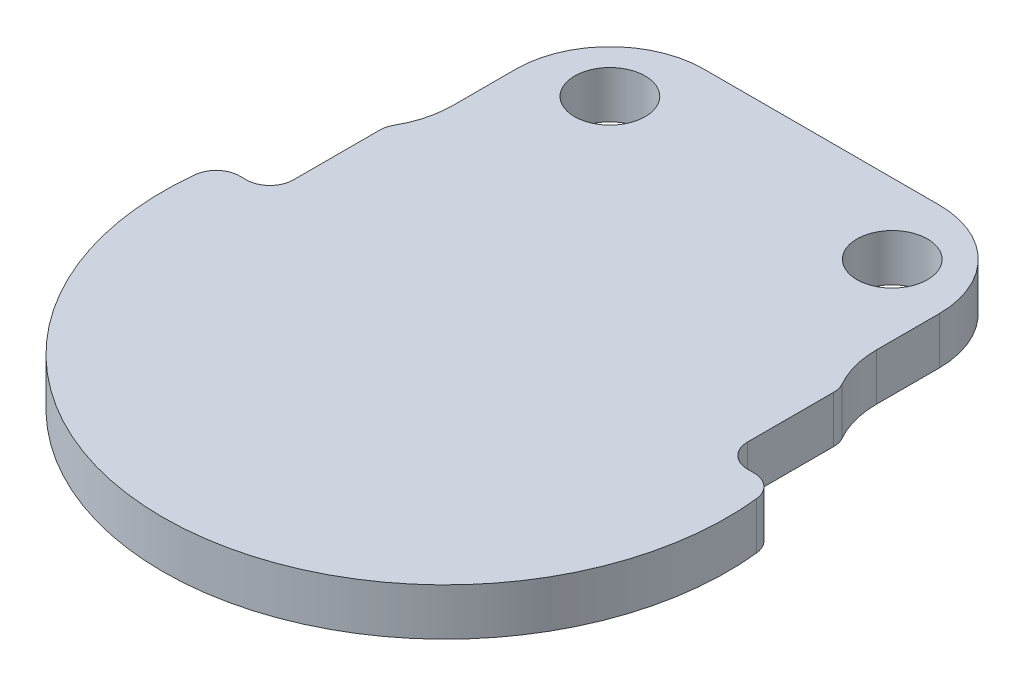
ISO-10303-21;
HEADER;
FILE_DESCRIPTION(('STEP AP214'),'2;1');
FILE_NAME('part.step','',(''),(''),'','','');
FILE_SCHEMA(('AUTOMOTIVE_DESIGN { 1 0 10303 214 1 1 1 1 }'));
ENDSEC;
DATA;
#1=APPLICATION_CONTEXT('core data for automotive mechanical design processes');
#2=APPLICATION_PROTOCOL_DEFINITION('international standard','automotive_design',2000,#1);
#3=PRODUCT_CONTEXT('',#1,'mechanical');
#4=PRODUCT('Part','Part','',(#3));
#5=PRODUCT_RELATED_PRODUCT_CATEGORY('part','',(#4));
#6=PRODUCT_DEFINITION_FORMATION('','',#4);
#7=PRODUCT_DEFINITION_CONTEXT('part definition',#1,'design');
#8=PRODUCT_DEFINITION('design','',#6,#7);
#9=PRODUCT_DEFINITION_SHAPE('','',#8);
#10=(LENGTH_UNIT() NAMED_UNIT(*) SI_UNIT(.MILLI.,.METRE.));
#11=(NAMED_UNIT(*) PLANE_ANGLE_UNIT() SI_UNIT($,.RADIAN.));
#12=(NAMED_UNIT(*) SI_UNIT($,.STERADIAN.) SOLID_ANGLE_UNIT());
#13=UNCERTAINTY_MEASURE_WITH_UNIT(LENGTH_MEASURE(1.E-05),#10,'distance_accuracy_value','');
#14=(GEOMETRIC_REPRESENTATION_CONTEXT(3) GLOBAL_UNCERTAINTY_ASSIGNED_CONTEXT((#13)) GLOBAL_UNIT_ASSIGNED_CONTEXT((#10,
#11,#12)) REPRESENTATION_CONTEXT('',''));
#15=CARTESIAN_POINT('',(0.,0.,0.));
#16=DIRECTION('',(0.,0.,1.));
#17=DIRECTION('',(1.,0.,0.));
#18=AXIS2_PLACEMENT_3D('',#15,#16,#17);
#19=CARTESIAN_POINT('',(0.,2.,0.));
#20=DIRECTION('',(0.,1.,0.));
#21=DIRECTION('',(0.,0.,1.));
#22=AXIS2_PLACEMENT_3D('',#19,#20,#21);
#23=PLANE('',#22);
#24=CARTESIAN_POINT('',(0.,2.,0.));
#25=DIRECTION('',(0.,1.,0.));
#26=DIRECTION('',(0.,0.,1.));
#27=AXIS2_PLACEMENT_3D('',#24,#25,#26);
#28=CIRCLE('',#27,12.);
#29=CARTESIAN_POINT('',(-11.9283813232029,2.,-1.30909090909089));
#30=VERTEX_POINT('',#29);
#31=CARTESIAN_POINT('',(11.9283813232029,2.,-1.30909090909088));
#32=VERTEX_POINT('',#31);
#33=EDGE_CURVE('E182',#30,#32,#28,.T.);
#34=ORIENTED_EDGE('',*,*,#33,.T.);
#35=CARTESIAN_POINT('',(10.9343495462693,2.,-1.19999999999998));
#36=DIRECTION('',(0.,1.,0.));
#37=DIRECTION('',(0.,0.,1.));
#38=AXIS2_PLACEMENT_3D('',#35,#36,#37);
#39=CIRCLE('',#38,1.);
#40=CARTESIAN_POINT('',(10.9343495462693,2.,-2.19999999999998));
#41=VERTEX_POINT('',#40);
#42=EDGE_CURVE('E251',#32,#41,#39,.T.);
#43=ORIENTED_EDGE('',*,*,#42,.T.);
#44=DIRECTION('',(1.,0.,0.));
#45=VECTOR('',#44,1.);
#46=CARTESIAN_POINT('',(11.7966096824469,2.,-2.19999999999998));
#47=LINE('',#46,#45);
#48=CARTESIAN_POINT('',(10.65,2.,-2.19999999999998));
#49=VERTEX_POINT('',#48);
#50=EDGE_CURVE('E276',#49,#41,#47,.T.);
#51=ORIENTED_EDGE('',*,*,#50,.F.);
#52=CARTESIAN_POINT('',(10.65,2.,-3.19999999999998));
#53=DIRECTION('',(0.,1.,0.));
#54=DIRECTION('',(0.,0.,1.));
#55=AXIS2_PLACEMENT_3D('',#52,#53,#54);
#56=CIRCLE('',#55,1.);
#57=CARTESIAN_POINT('',(9.65000000000001,2.,-3.19999999999998));
#58=VERTEX_POINT('',#57);
#59=EDGE_CURVE('E43',#49,#58,#56,.F.);
#60=ORIENTED_EDGE('',*,*,#59,.T.);
#61=DIRECTION('',(0.,0.,1.));
#62=VECTOR('',#61,1.);
#63=CARTESIAN_POINT('',(9.65000000000001,2.,-2.19999999999998));
#64=LINE('',#63,#62);
#65=CARTESIAN_POINT('',(9.65000000000001,2.,-6.86212044596459));
#66=VERTEX_POINT('',#65);
#67=EDGE_CURVE('E273',#66,#58,#64,.T.);
#68=ORIENTED_EDGE('',*,*,#67,.F.);
#69=CARTESIAN_POINT('',(8.65000000000001,2.,-6.86212044596459));
#70=DIRECTION('',(0.,1.,0.));
#71=DIRECTION('',(0.,0.,1.));
#72=AXIS2_PLACEMENT_3D('',#69,#70,#71);
#73=CIRCLE('',#72,1.);
#74=CARTESIAN_POINT('',(9.52,2.,-7.35517216738944));
#75=VERTEX_POINT('',#74);
#76=EDGE_CURVE('E249',#66,#75,#73,.T.);
#77=ORIENTED_EDGE('',*,*,#76,.T.);
#78=CARTESIAN_POINT('',(13.,2.,-9.32737905308882));
#79=DIRECTION('',(0.,1.,0.));
#80=DIRECTION('',(0.,0.,1.));
#81=AXIS2_PLACEMENT_3D('',#78,#79,#80);
#82=CIRCLE('',#81,4.);
#83=CARTESIAN_POINT('',(9.,2.,-9.32737905308882));
#84=VERTEX_POINT('',#83);
#85=EDGE_CURVE('E219',#75,#84,#82,.F.);
#86=ORIENTED_EDGE('',*,*,#85,.T.);
#87=DIRECTION('',(0.,0.,-1.));
#88=VECTOR('',#87,1.);
#89=CARTESIAN_POINT('',(9.,2.,-10.));
#90=LINE('',#89,#88);
#91=CARTESIAN_POINT('',(8.99999999999999,2.,-12.));
#92=VERTEX_POINT('',#91);
#93=EDGE_CURVE('E192',#84,#92,#90,.T.);
#94=ORIENTED_EDGE('',*,*,#93,.T.);
#95=CARTESIAN_POINT('',(5.,2.,-12.));
#96=DIRECTION('',(0.,1.,0.));
#97=DIRECTION('',(0.,0.,1.));
#98=AXIS2_PLACEMENT_3D('',#95,#96,#97);
#99=CIRCLE('',#98,4.);
#100=CARTESIAN_POINT('',(5.,2.,-16.));
#101=VERTEX_POINT('',#100);
#102=EDGE_CURVE('E203',#92,#101,#99,.T.);
#103=ORIENTED_EDGE('',*,*,#102,.T.);
#104=DIRECTION('',(-1.,0.,0.));
#105=VECTOR('',#104,1.);
#106=CARTESIAN_POINT('',(-9.,2.,-16.));
#107=LINE('',#106,#105);
#108=CARTESIAN_POINT('',(-4.99999999999999,2.,-16.));
#109=VERTEX_POINT('',#108);
#110=EDGE_CURVE('E323',#101,#109,#107,.T.);
#111=ORIENTED_EDGE('',*,*,#110,.T.);
#112=CARTESIAN_POINT('',(-4.99999999999999,2.,-12.));
#113=DIRECTION('',(0.,1.,0.));
#114=DIRECTION('',(0.,0.,1.));
#115=AXIS2_PLACEMENT_3D('',#112,#113,#114);
#116=CIRCLE('',#115,4.);
#117=CARTESIAN_POINT('',(-9.,2.,-12.));
#118=VERTEX_POINT('',#117);
#119=EDGE_CURVE('E205',#109,#118,#116,.T.);
#120=ORIENTED_EDGE('',*,*,#119,.T.);
#121=DIRECTION('',(0.,0.,1.));
#122=VECTOR('',#121,1.);
#123=CARTESIAN_POINT('',(-9.,2.,-16.));
#124=LINE('',#123,#122);
#125=CARTESIAN_POINT('',(-9.,2.,-9.32737905308881));
#126=VERTEX_POINT('',#125);
#127=EDGE_CURVE('E180',#118,#126,#124,.T.);
#128=ORIENTED_EDGE('',*,*,#127,.T.);
#129=CARTESIAN_POINT('',(-13.,2.,-9.32737905308882));
#130=DIRECTION('',(0.,1.,0.));
#131=DIRECTION('',(0.,0.,1.));
#132=AXIS2_PLACEMENT_3D('',#129,#130,#131);
#133=CIRCLE('',#132,4.);
#134=CARTESIAN_POINT('',(-9.52,2.,-7.35517216738944));
#135=VERTEX_POINT('',#134);
#136=EDGE_CURVE('E213',#126,#135,#133,.F.);
#137=ORIENTED_EDGE('',*,*,#136,.T.);
#138=CARTESIAN_POINT('',(-8.65000000000001,2.,-6.86212044596459));
#139=DIRECTION('',(0.,1.,0.));
#140=DIRECTION('',(0.,0.,1.));
#141=AXIS2_PLACEMENT_3D('',#138,#139,#140);
#142=CIRCLE('',#141,1.);
#143=CARTESIAN_POINT('',(-9.65000000000001,2.,-6.86212044596459));
#144=VERTEX_POINT('',#143);
#145=EDGE_CURVE('E247',#135,#144,#142,.T.);
#146=ORIENTED_EDGE('',*,*,#145,.T.);
#147=DIRECTION('',(0.,0.,-1.));
#148=VECTOR('',#147,1.);
#149=CARTESIAN_POINT('',(-9.65000000000001,2.,-2.19999999999998));
#150=LINE('',#149,#148);
#151=CARTESIAN_POINT('',(-9.65000000000001,2.,-3.19999999999998));
#152=VERTEX_POINT('',#151);
#153=EDGE_CURVE('E297',#152,#144,#150,.T.);
#154=ORIENTED_EDGE('',*,*,#153,.F.);
#155=CARTESIAN_POINT('',(-10.65,2.,-3.19999999999998));
#156=DIRECTION('',(0.,1.,0.));
#157=DIRECTION('',(0.,0.,1.));
#158=AXIS2_PLACEMENT_3D('',#155,#156,#157);
#159=CIRCLE('',#158,1.);
#160=CARTESIAN_POINT('',(-10.65,2.,-2.19999999999998));
#161=VERTEX_POINT('',#160);
#162=EDGE_CURVE('E264',#152,#161,#159,.F.);
#163=ORIENTED_EDGE('',*,*,#162,.T.);
#164=DIRECTION('',(1.,0.,0.));
#165=VECTOR('',#164,1.);
#166=CARTESIAN_POINT('',(-11.7966096824469,2.,-2.19999999999998));
#167=LINE('',#166,#165);
#168=CARTESIAN_POINT('',(-10.9343495462693,2.,-2.19999999999998));
#169=VERTEX_POINT('',#168);
#170=EDGE_CURVE('E294',#169,#161,#167,.T.);
#171=ORIENTED_EDGE('',*,*,#170,.F.);
#172=CARTESIAN_POINT('',(-10.9343495462693,2.,-1.19999999999998));
#173=DIRECTION('',(0.,1.,0.));
#174=DIRECTION('',(0.,0.,1.));
#175=AXIS2_PLACEMENT_3D('',#172,#173,#174);
#176=CIRCLE('',#175,1.);
#177=EDGE_CURVE('E245',#169,#30,#176,.T.);
#178=ORIENTED_EDGE('',*,*,#177,.T.);
#179=EDGE_LOOP('',(#34,#43,#51,#60,#68,#77,#86,#94,#103,#111,#120,#128,#137,#146,#154,#163,#171,#178));
#180=FACE_BOUND('',#179,.T.);
#181=CARTESIAN_POINT('',(-6.,2.,-13.));
#182=DIRECTION('',(0.,1.,0.));
#183=DIRECTION('',(0.,0.,1.));
#184=AXIS2_PLACEMENT_3D('',#181,#182,#183);
#185=CIRCLE('',#184,1.5);
#186=CARTESIAN_POINT('',(-6.,2.,-11.5));
#187=VERTEX_POINT('',#186);
#188=EDGE_CURVE('E316',#187,#187,#185,.T.);
#189=ORIENTED_EDGE('',*,*,#188,.F.);
#190=EDGE_LOOP('',(#189));
#191=FACE_BOUND('',#190,.T.);
#192=CARTESIAN_POINT('',(6.,2.,-13.));
#193=DIRECTION('',(0.,1.,0.));
#194=DIRECTION('',(0.,0.,1.));
#195=AXIS2_PLACEMENT_3D('',#192,#193,#194);
#196=CIRCLE('',#195,1.5);
#197=CARTESIAN_POINT('',(6.,2.,-11.5));
#198=VERTEX_POINT('',#197);
#199=EDGE_CURVE('E310',#198,#198,#196,.T.);
#200=ORIENTED_EDGE('',*,*,#199,.F.);
#201=EDGE_LOOP('',(#200));
#202=FACE_BOUND('',#201,.T.);
#203=ADVANCED_FACE('F35',(#180,#191,#202),#23,.T.);
#204=CARTESIAN_POINT('',(0.,0.,0.));
#205=DIRECTION('',(0.,1.,0.));
#206=DIRECTION('',(0.,0.,1.));
#207=AXIS2_PLACEMENT_3D('',#204,#205,#206);
#208=PLANE('',#207);
#209=DIRECTION('',(1.,0.,0.));
#210=VECTOR('',#209,1.);
#211=CARTESIAN_POINT('',(11.7966096824469,0.,-2.19999999999998));
#212=LINE('',#211,#210);
#213=CARTESIAN_POINT('',(10.65,0.,-2.19999999999998));
#214=VERTEX_POINT('',#213);
#215=CARTESIAN_POINT('',(10.9343495462693,0.,-2.19999999999998));
#216=VERTEX_POINT('',#215);
#217=EDGE_CURVE('E288',#214,#216,#212,.T.);
#218=ORIENTED_EDGE('',*,*,#217,.T.);
#219=CARTESIAN_POINT('',(10.9343495462693,0.,-1.19999999999998));
#220=DIRECTION('',(0.,1.,0.));
#221=DIRECTION('',(0.,0.,1.));
#222=AXIS2_PLACEMENT_3D('',#219,#220,#221);
#223=CIRCLE('',#222,1.);
#224=CARTESIAN_POINT('',(11.9283813232029,0.,-1.30909090909088));
#225=VERTEX_POINT('',#224);
#226=EDGE_CURVE('E257',#216,#225,#223,.F.);
#227=ORIENTED_EDGE('',*,*,#226,.T.);
#228=CARTESIAN_POINT('',(0.,0.,0.));
#229=DIRECTION('',(0.,1.,0.));
#230=DIRECTION('',(0.,0.,1.));
#231=AXIS2_PLACEMENT_3D('',#228,#229,#230);
#232=CIRCLE('',#231,12.);
#233=CARTESIAN_POINT('',(-11.9283813232029,0.,-1.30909090909089));
#234=VERTEX_POINT('',#233);
#235=EDGE_CURVE('E188',#234,#225,#232,.T.);
#236=ORIENTED_EDGE('',*,*,#235,.F.);
#237=CARTESIAN_POINT('',(-10.9343495462693,0.,-1.19999999999998));
#238=DIRECTION('',(0.,1.,0.));
#239=DIRECTION('',(0.,0.,1.));
#240=AXIS2_PLACEMENT_3D('',#237,#238,#239);
#241=CIRCLE('',#240,1.);
#242=CARTESIAN_POINT('',(-10.9343495462693,0.,-2.19999999999998));
#243=VERTEX_POINT('',#242);
#244=EDGE_CURVE('E253',#234,#243,#241,.F.);
#245=ORIENTED_EDGE('',*,*,#244,.T.);
#246=DIRECTION('',(1.,0.,0.));
#247=VECTOR('',#246,1.);
#248=CARTESIAN_POINT('',(-11.7966096824469,0.,-2.19999999999998));
#249=LINE('',#248,#247);
#250=CARTESIAN_POINT('',(-10.65,0.,-2.19999999999998));
#251=VERTEX_POINT('',#250);
#252=EDGE_CURVE('E302',#243,#251,#249,.T.);
#253=ORIENTED_EDGE('',*,*,#252,.T.);
#254=CARTESIAN_POINT('',(-10.65,0.,-3.19999999999998));
#255=DIRECTION('',(0.,1.,0.));
#256=DIRECTION('',(0.,0.,1.));
#257=AXIS2_PLACEMENT_3D('',#254,#255,#256);
#258=CIRCLE('',#257,1.);
#259=CARTESIAN_POINT('',(-9.65000000000001,0.,-3.19999999999998));
#260=VERTEX_POINT('',#259);
#261=EDGE_CURVE('E266',#251,#260,#258,.T.);
#262=ORIENTED_EDGE('',*,*,#261,.T.);
#263=DIRECTION('',(0.,0.,-1.));
#264=VECTOR('',#263,1.);
#265=CARTESIAN_POINT('',(-9.65000000000001,0.,-2.19999999999998));
#266=LINE('',#265,#264);
#267=CARTESIAN_POINT('',(-9.65000000000001,0.,-6.86212044596459));
#268=VERTEX_POINT('',#267);
#269=EDGE_CURVE('E305',#260,#268,#266,.T.);
#270=ORIENTED_EDGE('',*,*,#269,.T.);
#271=CARTESIAN_POINT('',(-8.65000000000001,0.,-6.86212044596459));
#272=DIRECTION('',(0.,1.,0.));
#273=DIRECTION('',(0.,0.,1.));
#274=AXIS2_PLACEMENT_3D('',#271,#272,#273);
#275=CIRCLE('',#274,1.);
#276=CARTESIAN_POINT('',(-9.52,0.,-7.35517216738944));
#277=VERTEX_POINT('',#276);
#278=EDGE_CURVE('E58',#268,#277,#275,.F.);
#279=ORIENTED_EDGE('',*,*,#278,.T.);
#280=CARTESIAN_POINT('',(-13.,0.,-9.32737905308882));
#281=DIRECTION('',(0.,1.,0.));
#282=DIRECTION('',(0.,0.,1.));
#283=AXIS2_PLACEMENT_3D('',#280,#281,#282);
#284=CIRCLE('',#283,4.);
#285=CARTESIAN_POINT('',(-9.,0.,-9.32737905308881));
#286=VERTEX_POINT('',#285);
#287=EDGE_CURVE('E187',#277,#286,#284,.T.);
#288=ORIENTED_EDGE('',*,*,#287,.T.);
#289=DIRECTION('',(0.,0.,1.));
#290=VECTOR('',#289,1.);
#291=CARTESIAN_POINT('',(-9.,0.,-10.));
#292=LINE('',#291,#290);
#293=CARTESIAN_POINT('',(-8.99999999999999,0.,-12.));
#294=VERTEX_POINT('',#293);
#295=EDGE_CURVE('E177',#294,#286,#292,.T.);
#296=ORIENTED_EDGE('',*,*,#295,.F.);
#297=CARTESIAN_POINT('',(-4.99999999999999,0.,-12.));
#298=DIRECTION('',(0.,1.,0.));
#299=DIRECTION('',(0.,0.,1.));
#300=AXIS2_PLACEMENT_3D('',#297,#298,#299);
#301=CIRCLE('',#300,4.);
#302=CARTESIAN_POINT('',(-4.99999999999999,0.,-16.));
#303=VERTEX_POINT('',#302);
#304=EDGE_CURVE('E161',#294,#303,#301,.F.);
#305=ORIENTED_EDGE('',*,*,#304,.T.);
#306=DIRECTION('',(-1.,0.,0.));
#307=VECTOR('',#306,1.);
#308=CARTESIAN_POINT('',(-9.,0.,-16.));
#309=LINE('',#308,#307);
#310=CARTESIAN_POINT('',(5.,0.,-16.));
#311=VERTEX_POINT('',#310);
#312=EDGE_CURVE('E189',#311,#303,#309,.T.);
#313=ORIENTED_EDGE('',*,*,#312,.F.);
#314=CARTESIAN_POINT('',(5.,0.,-12.));
#315=DIRECTION('',(0.,1.,0.));
#316=DIRECTION('',(0.,0.,1.));
#317=AXIS2_PLACEMENT_3D('',#314,#315,#316);
#318=CIRCLE('',#317,4.);
#319=CARTESIAN_POINT('',(9.,0.,-12.));
#320=VERTEX_POINT('',#319);
#321=EDGE_CURVE('E171',#311,#320,#318,.F.);
#322=ORIENTED_EDGE('',*,*,#321,.T.);
#323=DIRECTION('',(0.,0.,-1.));
#324=VECTOR('',#323,1.);
#325=CARTESIAN_POINT('',(9.,0.,-16.));
#326=LINE('',#325,#324);
#327=CARTESIAN_POINT('',(9.,0.,-9.32737905308882));
#328=VERTEX_POINT('',#327);
#329=EDGE_CURVE('E194',#328,#320,#326,.T.);
#330=ORIENTED_EDGE('',*,*,#329,.F.);
#331=CARTESIAN_POINT('',(13.,0.,-9.32737905308882));
#332=DIRECTION('',(0.,1.,0.));
#333=DIRECTION('',(0.,0.,1.));
#334=AXIS2_PLACEMENT_3D('',#331,#332,#333);
#335=CIRCLE('',#334,4.);
#336=CARTESIAN_POINT('',(9.52,0.,-7.35517216738944));
#337=VERTEX_POINT('',#336);
#338=EDGE_CURVE('E216',#328,#337,#335,.T.);
#339=ORIENTED_EDGE('',*,*,#338,.T.);
#340=CARTESIAN_POINT('',(8.65000000000001,0.,-6.86212044596459));
#341=DIRECTION('',(0.,1.,0.));
#342=DIRECTION('',(0.,0.,1.));
#343=AXIS2_PLACEMENT_3D('',#340,#341,#342);
#344=CIRCLE('',#343,1.);
#345=CARTESIAN_POINT('',(9.65000000000001,0.,-6.86212044596459));
#346=VERTEX_POINT('',#345);
#347=EDGE_CURVE('E50',#337,#346,#344,.F.);
#348=ORIENTED_EDGE('',*,*,#347,.T.);
#349=DIRECTION('',(0.,0.,1.));
#350=VECTOR('',#349,1.);
#351=CARTESIAN_POINT('',(9.65000000000001,0.,-2.19999999999998));
#352=LINE('',#351,#350);
#353=CARTESIAN_POINT('',(9.65000000000001,0.,-3.19999999999998));
#354=VERTEX_POINT('',#353);
#355=EDGE_CURVE('E290',#346,#354,#352,.T.);
#356=ORIENTED_EDGE('',*,*,#355,.T.);
#357=CARTESIAN_POINT('',(10.65,0.,-3.19999999999998));
#358=DIRECTION('',(0.,1.,0.));
#359=DIRECTION('',(0.,0.,1.));
#360=AXIS2_PLACEMENT_3D('',#357,#358,#359);
#361=CIRCLE('',#360,1.);
#362=EDGE_CURVE('E11',#354,#214,#361,.T.);
#363=ORIENTED_EDGE('',*,*,#362,.T.);
#364=EDGE_LOOP('',(#218,#227,#236,#245,#253,#262,#270,#279,#288,#296,#305,#313,#322,#330,#339,
#348,#356,#363));
#365=FACE_BOUND('',#364,.T.);
#366=CARTESIAN_POINT('',(-6.,0.,-13.));
#367=DIRECTION('',(0.,1.,0.));
#368=DIRECTION('',(0.,0.,1.));
#369=AXIS2_PLACEMENT_3D('',#366,#367,#368);
#370=CIRCLE('',#369,1.5);
#371=CARTESIAN_POINT('',(-6.,0.,-11.5));
#372=VERTEX_POINT('',#371);
#373=EDGE_CURVE('E313',#372,#372,#370,.T.);
#374=ORIENTED_EDGE('',*,*,#373,.T.);
#375=EDGE_LOOP('',(#374));
#376=FACE_BOUND('',#375,.T.);
#377=CARTESIAN_POINT('',(6.,0.,-13.));
#378=DIRECTION('',(0.,1.,0.));
#379=DIRECTION('',(0.,0.,1.));
#380=AXIS2_PLACEMENT_3D('',#377,#378,#379);
#381=CIRCLE('',#380,1.5);
#382=CARTESIAN_POINT('',(6.,0.,-11.5));
#383=VERTEX_POINT('',#382);
#384=EDGE_CURVE('E306',#383,#383,#381,.T.);
#385=ORIENTED_EDGE('',*,*,#384,.T.);
#386=EDGE_LOOP('',(#385));
#387=FACE_BOUND('',#386,.T.);
#388=ADVANCED_FACE('F185',(#365,#376,#387),#208,.F.);
#389=CARTESIAN_POINT('',(9.,2.,-16.));
#390=DIRECTION('',(-1.,0.,0.));
#391=DIRECTION('',(0.,0.,1.));
#392=AXIS2_PLACEMENT_3D('',#389,#390,#391);
#393=PLANE('',#392);
#394=ORIENTED_EDGE('',*,*,#329,.T.);
#395=DIRECTION('',(0.,-1.,0.));
#396=VECTOR('',#395,1.);
#397=CARTESIAN_POINT('',(9.,2.,-12.));
#398=LINE('',#397,#396);
#399=EDGE_CURVE('E210',#320,#92,#398,.F.);
#400=ORIENTED_EDGE('',*,*,#399,.T.);
#401=ORIENTED_EDGE('',*,*,#93,.F.);
#402=DIRECTION('',(0.,1.,0.));
#403=VECTOR('',#402,1.);
#404=CARTESIAN_POINT('',(9.,0.,-9.32737905308882));
#405=LINE('',#404,#403);
#406=EDGE_CURVE('E207',#84,#328,#405,.F.);
#407=ORIENTED_EDGE('',*,*,#406,.T.);
#408=EDGE_LOOP('',(#394,#400,#401,#407));
#409=FACE_BOUND('',#408,.T.);
#410=ADVANCED_FACE('F331',(#409),#393,.F.);
#411=CARTESIAN_POINT('',(-9.,2.,-16.));
#412=DIRECTION('',(0.,0.,1.));
#413=DIRECTION('',(1.,0.,0.));
#414=AXIS2_PLACEMENT_3D('',#411,#412,#413);
#415=PLANE('',#414);
#416=ORIENTED_EDGE('',*,*,#312,.T.);
#417=DIRECTION('',(0.,-1.,0.));
#418=VECTOR('',#417,1.);
#419=CARTESIAN_POINT('',(-4.99999999999999,2.,-16.));
#420=LINE('',#419,#418);
#421=EDGE_CURVE('E166',#303,#109,#420,.F.);
#422=ORIENTED_EDGE('',*,*,#421,.T.);
#423=ORIENTED_EDGE('',*,*,#110,.F.);
#424=DIRECTION('',(0.,-1.,0.));
#425=VECTOR('',#424,1.);
#426=CARTESIAN_POINT('',(5.,2.,-16.));
#427=LINE('',#426,#425);
#428=EDGE_CURVE('E170',#101,#311,#427,.T.);
#429=ORIENTED_EDGE('',*,*,#428,.T.);
#430=EDGE_LOOP('',(#416,#422,#423,#429));
#431=FACE_BOUND('',#430,.T.);
#432=ADVANCED_FACE('F340',(#431),#415,.F.);
#433=CARTESIAN_POINT('',(-9.,2.,-10.));
#434=DIRECTION('',(1.,0.,0.));
#435=DIRECTION('',(0.,0.,-1.));
#436=AXIS2_PLACEMENT_3D('',#433,#434,#435);
#437=PLANE('',#436);
#438=ORIENTED_EDGE('',*,*,#295,.T.);
#439=DIRECTION('',(0.,1.,0.));
#440=VECTOR('',#439,1.);
#441=CARTESIAN_POINT('',(-9.,2.,-9.32737905308881));
#442=LINE('',#441,#440);
#443=EDGE_CURVE('E181',#286,#126,#442,.T.);
#444=ORIENTED_EDGE('',*,*,#443,.T.);
#445=ORIENTED_EDGE('',*,*,#127,.F.);
#446=DIRECTION('',(0.,-1.,0.));
#447=VECTOR('',#446,1.);
#448=CARTESIAN_POINT('',(-8.99999999999999,2.,-12.));
#449=LINE('',#448,#447);
#450=EDGE_CURVE('E165',#118,#294,#449,.T.);
#451=ORIENTED_EDGE('',*,*,#450,.T.);
#452=EDGE_LOOP('',(#438,#444,#445,#451));
#453=FACE_BOUND('',#452,.T.);
#454=ADVANCED_FACE('F176',(#453),#437,.F.);
#455=CARTESIAN_POINT('',(0.,2.,0.));
#456=DIRECTION('',(0.,-1.,0.));
#457=DIRECTION('',(0.,0.,-1.));
#458=AXIS2_PLACEMENT_3D('',#455,#456,#457);
#459=CYLINDRICAL_SURFACE('',#458,12.);
#460=ORIENTED_EDGE('',*,*,#235,.T.);
#461=DIRECTION('',(0.,-1.,0.));
#462=VECTOR('',#461,1.);
#463=CARTESIAN_POINT('',(11.9283813232029,2.,-1.30909090909088));
#464=LINE('',#463,#462);
#465=EDGE_CURVE('E242',#225,#32,#464,.F.);
#466=ORIENTED_EDGE('',*,*,#465,.T.);
#467=ORIENTED_EDGE('',*,*,#33,.F.);
#468=DIRECTION('',(0.,-1.,0.));
#469=VECTOR('',#468,1.);
#470=CARTESIAN_POINT('',(-11.9283813232029,2.,-1.30909090909089));
#471=LINE('',#470,#469);
#472=EDGE_CURVE('E240',#30,#234,#471,.T.);
#473=ORIENTED_EDGE('',*,*,#472,.T.);
#474=EDGE_LOOP('',(#460,#466,#467,#473));
#475=FACE_BOUND('',#474,.T.);
#476=ADVANCED_FACE('F347',(#475),#459,.T.);
#477=CARTESIAN_POINT('',(-6.,2.,-13.));
#478=DIRECTION('',(0.,-1.,0.));
#479=DIRECTION('',(0.,0.,-1.));
#480=AXIS2_PLACEMENT_3D('',#477,#478,#479);
#481=CYLINDRICAL_SURFACE('',#480,1.5);
#482=ORIENTED_EDGE('',*,*,#188,.T.);
#483=EDGE_LOOP('',(#482));
#484=FACE_BOUND('',#483,.T.);
#485=ORIENTED_EDGE('',*,*,#373,.F.);
#486=EDGE_LOOP('',(#485));
#487=FACE_BOUND('',#486,.T.);
#488=ADVANCED_FACE('F358',(#484,#487),#481,.F.);
#489=CARTESIAN_POINT('',(6.,2.,-13.));
#490=DIRECTION('',(0.,-1.,0.));
#491=DIRECTION('',(0.,0.,-1.));
#492=AXIS2_PLACEMENT_3D('',#489,#490,#491);
#493=CYLINDRICAL_SURFACE('',#492,1.5);
#494=ORIENTED_EDGE('',*,*,#199,.T.);
#495=EDGE_LOOP('',(#494));
#496=FACE_BOUND('',#495,.T.);
#497=ORIENTED_EDGE('',*,*,#384,.F.);
#498=EDGE_LOOP('',(#497));
#499=FACE_BOUND('',#498,.T.);
#500=ADVANCED_FACE('F367',(#496,#499),#493,.F.);
#501=CARTESIAN_POINT('',(-13.,2.,-9.32737905308882));
#502=DIRECTION('',(0.,-1.,0.));
#503=DIRECTION('',(0.,0.,-1.));
#504=AXIS2_PLACEMENT_3D('',#501,#502,#503);
#505=CYLINDRICAL_SURFACE('',#504,4.);
#506=ORIENTED_EDGE('',*,*,#287,.F.);
#507=DIRECTION('',(0.,-1.,0.));
#508=VECTOR('',#507,1.);
#509=CARTESIAN_POINT('',(-9.52,2.,-7.35517216738944));
#510=LINE('',#509,#508);
#511=EDGE_CURVE('E261',#277,#135,#510,.F.);
#512=ORIENTED_EDGE('',*,*,#511,.T.);
#513=ORIENTED_EDGE('',*,*,#136,.F.);
#514=ORIENTED_EDGE('',*,*,#443,.F.);
#515=EDGE_LOOP('',(#506,#512,#513,#514));
#516=FACE_BOUND('',#515,.T.);
#517=ADVANCED_FACE('F397',(#516),#505,.F.);
#518=CARTESIAN_POINT('',(-4.99999999999999,2.,-12.));
#519=DIRECTION('',(0.,-1.,0.));
#520=DIRECTION('',(0.,0.,-1.));
#521=AXIS2_PLACEMENT_3D('',#518,#519,#520);
#522=CYLINDRICAL_SURFACE('',#521,4.);
#523=ORIENTED_EDGE('',*,*,#119,.F.);
#524=ORIENTED_EDGE('',*,*,#421,.F.);
#525=ORIENTED_EDGE('',*,*,#304,.F.);
#526=ORIENTED_EDGE('',*,*,#450,.F.);
#527=EDGE_LOOP('',(#523,#524,#525,#526));
#528=FACE_BOUND('',#527,.T.);
#529=ADVANCED_FACE('F164',(#528),#522,.T.);
#530=CARTESIAN_POINT('',(5.,2.,-12.));
#531=DIRECTION('',(0.,-1.,0.));
#532=DIRECTION('',(0.,0.,-1.));
#533=AXIS2_PLACEMENT_3D('',#530,#531,#532);
#534=CYLINDRICAL_SURFACE('',#533,4.);
#535=ORIENTED_EDGE('',*,*,#102,.F.);
#536=ORIENTED_EDGE('',*,*,#399,.F.);
#537=ORIENTED_EDGE('',*,*,#321,.F.);
#538=ORIENTED_EDGE('',*,*,#428,.F.);
#539=EDGE_LOOP('',(#535,#536,#537,#538));
#540=FACE_BOUND('',#539,.T.);
#541=ADVANCED_FACE('F336',(#540),#534,.T.);
#542=CARTESIAN_POINT('',(13.,2.,-9.32737905308882));
#543=DIRECTION('',(0.,-1.,0.));
#544=DIRECTION('',(0.,0.,-1.));
#545=AXIS2_PLACEMENT_3D('',#542,#543,#544);
#546=CYLINDRICAL_SURFACE('',#545,4.);
#547=ORIENTED_EDGE('',*,*,#85,.F.);
#548=DIRECTION('',(0.,-1.,0.));
#549=VECTOR('',#548,1.);
#550=CARTESIAN_POINT('',(9.52,2.,-7.35517216738944));
#551=LINE('',#550,#549);
#552=EDGE_CURVE('E259',#75,#337,#551,.T.);
#553=ORIENTED_EDGE('',*,*,#552,.T.);
#554=ORIENTED_EDGE('',*,*,#338,.F.);
#555=ORIENTED_EDGE('',*,*,#406,.F.);
#556=EDGE_LOOP('',(#547,#553,#554,#555));
#557=FACE_BOUND('',#556,.T.);
#558=ADVANCED_FACE('F409',(#557),#546,.F.);
#559=CARTESIAN_POINT('',(-9.65000000000001,0.,-2.19999999999998));
#560=DIRECTION('',(1.,0.,0.));
#561=DIRECTION('',(0.,0.,-1.));
#562=AXIS2_PLACEMENT_3D('',#559,#560,#561);
#563=PLANE('',#562);
#564=ORIENTED_EDGE('',*,*,#269,.F.);
#565=DIRECTION('',(0.,1.,0.));
#566=VECTOR('',#565,1.);
#567=CARTESIAN_POINT('',(-9.65000000000001,2.,-3.19999999999998));
#568=LINE('',#567,#566);
#569=EDGE_CURVE('E223',#260,#152,#568,.T.);
#570=ORIENTED_EDGE('',*,*,#569,.T.);
#571=ORIENTED_EDGE('',*,*,#153,.T.);
#572=DIRECTION('',(0.,-1.,0.));
#573=VECTOR('',#572,1.);
#574=CARTESIAN_POINT('',(-9.65000000000001,0.,-6.86212044596459));
#575=LINE('',#574,#573);
#576=EDGE_CURVE('E221',#144,#268,#575,.T.);
#577=ORIENTED_EDGE('',*,*,#576,.T.);
#578=EDGE_LOOP('',(#564,#570,#571,#577));
#579=FACE_BOUND('',#578,.T.);
#580=ADVANCED_FACE('F389',(#579),#563,.F.);
#581=CARTESIAN_POINT('',(-11.7966096824469,0.,-2.19999999999998));
#582=DIRECTION('',(0.,0.,1.));
#583=DIRECTION('',(1.,0.,0.));
#584=AXIS2_PLACEMENT_3D('',#581,#582,#583);
#585=PLANE('',#584);
#586=ORIENTED_EDGE('',*,*,#170,.T.);
#587=DIRECTION('',(0.,1.,0.));
#588=VECTOR('',#587,1.);
#589=CARTESIAN_POINT('',(-10.65,0.,-2.19999999999998));
#590=LINE('',#589,#588);
#591=EDGE_CURVE('E229',#161,#251,#590,.F.);
#592=ORIENTED_EDGE('',*,*,#591,.T.);
#593=ORIENTED_EDGE('',*,*,#252,.F.);
#594=DIRECTION('',(0.,-1.,0.));
#595=VECTOR('',#594,1.);
#596=CARTESIAN_POINT('',(-10.9343495462693,0.,-2.19999999999998));
#597=LINE('',#596,#595);
#598=EDGE_CURVE('E226',#243,#169,#597,.F.);
#599=ORIENTED_EDGE('',*,*,#598,.T.);
#600=EDGE_LOOP('',(#586,#592,#593,#599));
#601=FACE_BOUND('',#600,.T.);
#602=ADVANCED_FACE('F382',(#601),#585,.F.);
#603=CARTESIAN_POINT('',(9.65000000000001,0.,-2.19999999999998));
#604=DIRECTION('',(-1.,0.,0.));
#605=DIRECTION('',(0.,0.,1.));
#606=AXIS2_PLACEMENT_3D('',#603,#604,#605);
#607=PLANE('',#606);
#608=ORIENTED_EDGE('',*,*,#67,.T.);
#609=DIRECTION('',(0.,1.,0.));
#610=VECTOR('',#609,1.);
#611=CARTESIAN_POINT('',(9.65000000000001,0.,-3.19999999999998));
#612=LINE('',#611,#610);
#613=EDGE_CURVE('E238',#58,#354,#612,.F.);
#614=ORIENTED_EDGE('',*,*,#613,.T.);
#615=ORIENTED_EDGE('',*,*,#355,.F.);
#616=DIRECTION('',(0.,-1.,0.));
#617=VECTOR('',#616,1.);
#618=CARTESIAN_POINT('',(9.65000000000001,0.,-6.86212044596459));
#619=LINE('',#618,#617);
#620=EDGE_CURVE('E236',#346,#66,#619,.F.);
#621=ORIENTED_EDGE('',*,*,#620,.T.);
#622=EDGE_LOOP('',(#608,#614,#615,#621));
#623=FACE_BOUND('',#622,.T.);
#624=ADVANCED_FACE('F281',(#623),#607,.F.);
#625=CARTESIAN_POINT('',(11.7966096824469,0.,-2.19999999999998));
#626=DIRECTION('',(0.,0.,1.));
#627=DIRECTION('',(1.,0.,0.));
#628=AXIS2_PLACEMENT_3D('',#625,#626,#627);
#629=PLANE('',#628);
#630=ORIENTED_EDGE('',*,*,#217,.F.);
#631=DIRECTION('',(0.,1.,0.));
#632=VECTOR('',#631,1.);
#633=CARTESIAN_POINT('',(10.65,2.,-2.19999999999998));
#634=LINE('',#633,#632);
#635=EDGE_CURVE('E233',#214,#49,#634,.T.);
#636=ORIENTED_EDGE('',*,*,#635,.T.);
#637=ORIENTED_EDGE('',*,*,#50,.T.);
#638=DIRECTION('',(0.,-1.,0.));
#639=VECTOR('',#638,1.);
#640=CARTESIAN_POINT('',(10.9343495462693,0.,-2.19999999999998));
#641=LINE('',#640,#639);
#642=EDGE_CURVE('E231',#41,#216,#641,.T.);
#643=ORIENTED_EDGE('',*,*,#642,.T.);
#644=EDGE_LOOP('',(#630,#636,#637,#643));
#645=FACE_BOUND('',#644,.T.);
#646=ADVANCED_FACE('F292',(#645),#629,.F.);
#647=CARTESIAN_POINT('',(-10.65,0.,-3.19999999999998));
#648=DIRECTION('',(0.,-1.,0.));
#649=DIRECTION('',(0.,0.,-1.));
#650=AXIS2_PLACEMENT_3D('',#647,#648,#649);
#651=CYLINDRICAL_SURFACE('',#650,1.);
#652=ORIENTED_EDGE('',*,*,#261,.F.);
#653=ORIENTED_EDGE('',*,*,#591,.F.);
#654=ORIENTED_EDGE('',*,*,#162,.F.);
#655=ORIENTED_EDGE('',*,*,#569,.F.);
#656=EDGE_LOOP('',(#652,#653,#654,#655));
#657=FACE_BOUND('',#656,.T.);
#658=ADVANCED_FACE('F385',(#657),#651,.F.);
#659=CARTESIAN_POINT('',(10.65,0.,-3.19999999999998));
#660=DIRECTION('',(0.,-1.,0.));
#661=DIRECTION('',(0.,0.,-1.));
#662=AXIS2_PLACEMENT_3D('',#659,#660,#661);
#663=CYLINDRICAL_SURFACE('',#662,1.);
#664=ORIENTED_EDGE('',*,*,#362,.F.);
#665=ORIENTED_EDGE('',*,*,#613,.F.);
#666=ORIENTED_EDGE('',*,*,#59,.F.);
#667=ORIENTED_EDGE('',*,*,#635,.F.);
#668=EDGE_LOOP('',(#664,#665,#666,#667));
#669=FACE_BOUND('',#668,.T.);
#670=ADVANCED_FACE('F286',(#669),#663,.F.);
#671=CARTESIAN_POINT('',(10.9343495462693,2.,-1.19999999999998));
#672=DIRECTION('',(0.,-1.,0.));
#673=DIRECTION('',(0.,0.,-1.));
#674=AXIS2_PLACEMENT_3D('',#671,#672,#673);
#675=CYLINDRICAL_SURFACE('',#674,1.);
#676=ORIENTED_EDGE('',*,*,#226,.F.);
#677=ORIENTED_EDGE('',*,*,#642,.F.);
#678=ORIENTED_EDGE('',*,*,#42,.F.);
#679=ORIENTED_EDGE('',*,*,#465,.F.);
#680=EDGE_LOOP('',(#676,#677,#678,#679));
#681=FACE_BOUND('',#680,.T.);
#682=ADVANCED_FACE('F375',(#681),#675,.T.);
#683=CARTESIAN_POINT('',(8.65000000000001,2.,-6.86212044596459));
#684=DIRECTION('',(0.,-1.,0.));
#685=DIRECTION('',(0.,0.,-1.));
#686=AXIS2_PLACEMENT_3D('',#683,#684,#685);
#687=CYLINDRICAL_SURFACE('',#686,1.);
#688=ORIENTED_EDGE('',*,*,#76,.F.);
#689=ORIENTED_EDGE('',*,*,#620,.F.);
#690=ORIENTED_EDGE('',*,*,#347,.F.);
#691=ORIENTED_EDGE('',*,*,#552,.F.);
#692=EDGE_LOOP('',(#688,#689,#690,#691));
#693=FACE_BOUND('',#692,.T.);
#694=ADVANCED_FACE('F418',(#693),#687,.T.);
#695=CARTESIAN_POINT('',(-8.65000000000001,2.,-6.86212044596459));
#696=DIRECTION('',(0.,-1.,0.));
#697=DIRECTION('',(0.,0.,-1.));
#698=AXIS2_PLACEMENT_3D('',#695,#696,#697);
#699=CYLINDRICAL_SURFACE('',#698,1.);
#700=ORIENTED_EDGE('',*,*,#278,.F.);
#701=ORIENTED_EDGE('',*,*,#576,.F.);
#702=ORIENTED_EDGE('',*,*,#145,.F.);
#703=ORIENTED_EDGE('',*,*,#511,.F.);
#704=EDGE_LOOP('',(#700,#701,#702,#703));
#705=FACE_BOUND('',#704,.T.);
#706=ADVANCED_FACE('F393',(#705),#699,.T.);
#707=CARTESIAN_POINT('',(-10.9343495462693,2.,-1.19999999999998));
#708=DIRECTION('',(0.,-1.,0.));
#709=DIRECTION('',(0.,0.,-1.));
#710=AXIS2_PLACEMENT_3D('',#707,#708,#709);
#711=CYLINDRICAL_SURFACE('',#710,1.);
#712=ORIENTED_EDGE('',*,*,#244,.F.);
#713=ORIENTED_EDGE('',*,*,#472,.F.);
#714=ORIENTED_EDGE('',*,*,#177,.F.);
#715=ORIENTED_EDGE('',*,*,#598,.F.);
#716=EDGE_LOOP('',(#712,#713,#714,#715));
#717=FACE_BOUND('',#716,.T.);
#718=ADVANCED_FACE('F37',(#717),#711,.T.);
#719=CLOSED_SHELL('',(#203,#388,#410,#432,#454,#476,#488,#500,#517,#529,#541,#558,#580,#602,
#624,#646,#658,#670,#682,#694,#706,#718));
#720=MANIFOLD_SOLID_BREP('B2',#719);
#721=ADVANCED_BREP_SHAPE_REPRESENTATION('',(#18,#720),#14);
#722=SHAPE_DEFINITION_REPRESENTATION(#9,#721);
ENDSEC;
END-ISO-10303-21;
